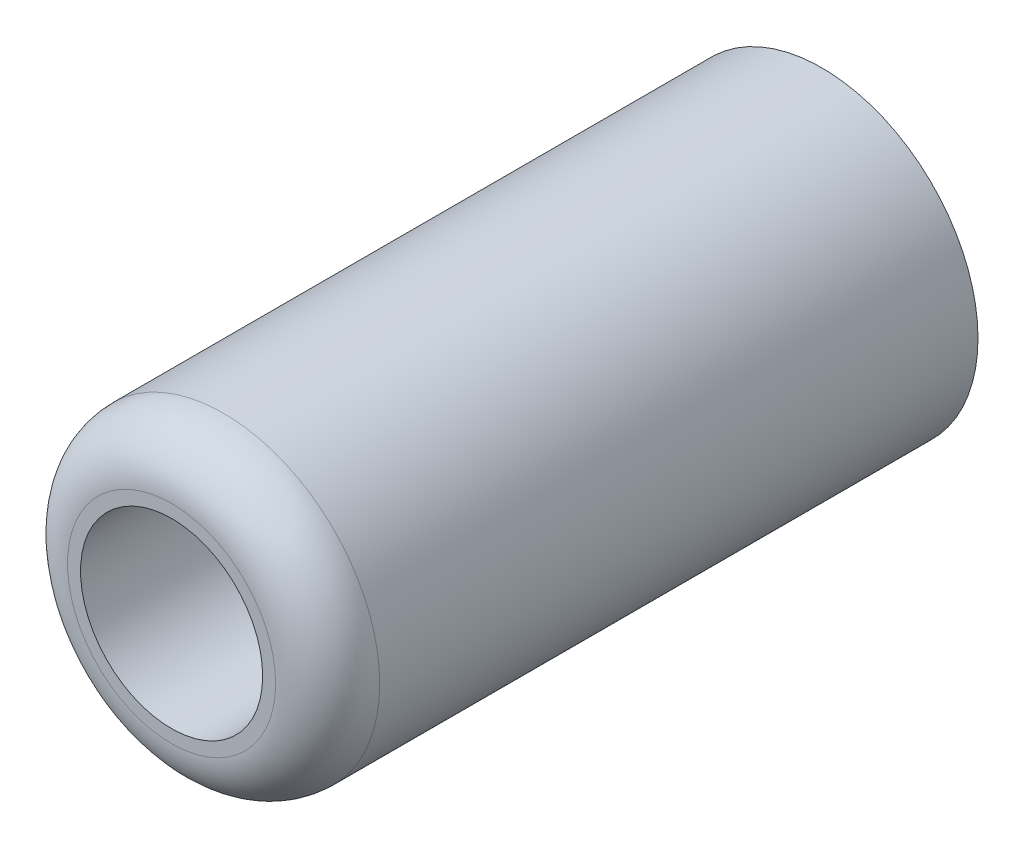
ISO-10303-21;
HEADER;
FILE_DESCRIPTION(('STEP AP214'),'2;1');
FILE_NAME('part.step','',(''),(''),'','','');
FILE_SCHEMA(('AUTOMOTIVE_DESIGN { 1 0 10303 214 1 1 1 1 }'));
ENDSEC;
DATA;
#1=APPLICATION_CONTEXT('core data for automotive mechanical design processes');
#2=APPLICATION_PROTOCOL_DEFINITION('international standard','automotive_design',2000,#1);
#3=PRODUCT_CONTEXT('',#1,'mechanical');
#4=PRODUCT('Part','Part','',(#3));
#5=PRODUCT_RELATED_PRODUCT_CATEGORY('part','',(#4));
#6=PRODUCT_DEFINITION_FORMATION('','',#4);
#7=PRODUCT_DEFINITION_CONTEXT('part definition',#1,'design');
#8=PRODUCT_DEFINITION('design','',#6,#7);
#9=PRODUCT_DEFINITION_SHAPE('','',#8);
#10=(LENGTH_UNIT() NAMED_UNIT(*) SI_UNIT(.MILLI.,.METRE.));
#11=(NAMED_UNIT(*) PLANE_ANGLE_UNIT() SI_UNIT($,.RADIAN.));
#12=(NAMED_UNIT(*) SI_UNIT($,.STERADIAN.) SOLID_ANGLE_UNIT());
#13=UNCERTAINTY_MEASURE_WITH_UNIT(LENGTH_MEASURE(1.E-05),#10,'distance_accuracy_value','');
#14=(GEOMETRIC_REPRESENTATION_CONTEXT(3) GLOBAL_UNCERTAINTY_ASSIGNED_CONTEXT((#13)) GLOBAL_UNIT_ASSIGNED_CONTEXT((#10,
#11,#12)) REPRESENTATION_CONTEXT('',''));
#15=CARTESIAN_POINT('',(0.,0.,0.));
#16=DIRECTION('',(0.,0.,1.));
#17=DIRECTION('',(1.,0.,0.));
#18=AXIS2_PLACEMENT_3D('',#15,#16,#17);
#19=CARTESIAN_POINT('',(0.,0.,12.5));
#20=DIRECTION('',(0.,0.,1.));
#21=DIRECTION('',(1.,0.,0.));
#22=AXIS2_PLACEMENT_3D('',#19,#20,#21);
#23=PLANE('',#22);
#24=CARTESIAN_POINT('',(0.,0.,12.5));
#25=DIRECTION('',(0.,0.,1.));
#26=DIRECTION('',(1.,0.,0.));
#27=AXIS2_PLACEMENT_3D('',#24,#25,#26);
#28=CIRCLE('',#27,2.);
#29=CARTESIAN_POINT('',(2.,0.,12.5));
#30=VERTEX_POINT('',#29);
#31=EDGE_CURVE('E38',#30,#30,#28,.T.);
#32=ORIENTED_EDGE('',*,*,#31,.T.);
#33=EDGE_LOOP('',(#32));
#34=FACE_BOUND('',#33,.T.);
#35=CARTESIAN_POINT('',(0.,0.,12.5));
#36=DIRECTION('',(0.,0.,1.));
#37=DIRECTION('',(1.,0.,0.));
#38=AXIS2_PLACEMENT_3D('',#35,#36,#37);
#39=CIRCLE('',#38,1.75);
#40=CARTESIAN_POINT('',(1.75,0.,12.5));
#41=VERTEX_POINT('',#40);
#42=EDGE_CURVE('E46',#41,#41,#39,.T.);
#43=ORIENTED_EDGE('',*,*,#42,.F.);
#44=EDGE_LOOP('',(#43));
#45=FACE_BOUND('',#44,.T.);
#46=ADVANCED_FACE('F31',(#34,#45),#23,.T.);
#47=CARTESIAN_POINT('',(0.,0.,0.));
#48=DIRECTION('',(0.,0.,1.));
#49=DIRECTION('',(1.,0.,0.));
#50=AXIS2_PLACEMENT_3D('',#47,#48,#49);
#51=PLANE('',#50);
#52=CARTESIAN_POINT('',(0.,0.,0.));
#53=DIRECTION('',(0.,0.,1.));
#54=DIRECTION('',(1.,0.,0.));
#55=AXIS2_PLACEMENT_3D('',#52,#53,#54);
#56=CIRCLE('',#55,3.);
#57=CARTESIAN_POINT('',(3.,0.,0.));
#58=VERTEX_POINT('',#57);
#59=EDGE_CURVE('E42',#58,#58,#56,.T.);
#60=ORIENTED_EDGE('',*,*,#59,.F.);
#61=EDGE_LOOP('',(#60));
#62=FACE_BOUND('',#61,.T.);
#63=CARTESIAN_POINT('',(0.,0.,0.));
#64=DIRECTION('',(0.,0.,1.));
#65=DIRECTION('',(1.,0.,0.));
#66=AXIS2_PLACEMENT_3D('',#63,#64,#65);
#67=CIRCLE('',#66,1.75);
#68=CARTESIAN_POINT('',(1.75,0.,0.));
#69=VERTEX_POINT('',#68);
#70=EDGE_CURVE('E49',#69,#69,#67,.T.);
#71=ORIENTED_EDGE('',*,*,#70,.T.);
#72=EDGE_LOOP('',(#71));
#73=FACE_BOUND('',#72,.T.);
#74=ADVANCED_FACE('F59',(#62,#73),#51,.F.);
#75=CARTESIAN_POINT('',(0.,0.,12.5));
#76=DIRECTION('',(0.,0.,-1.));
#77=DIRECTION('',(-1.,0.,0.));
#78=AXIS2_PLACEMENT_3D('',#75,#76,#77);
#79=CYLINDRICAL_SURFACE('',#78,3.);
#80=CARTESIAN_POINT('',(0.,0.,11.5));
#81=DIRECTION('',(0.,0.,1.));
#82=DIRECTION('',(1.,0.,0.));
#83=AXIS2_PLACEMENT_3D('',#80,#81,#82);
#84=CIRCLE('',#83,3.);
#85=CARTESIAN_POINT('',(3.,0.,11.5));
#86=VERTEX_POINT('',#85);
#87=EDGE_CURVE('E10',#86,#86,#84,.F.);
#88=ORIENTED_EDGE('',*,*,#87,.T.);
#89=EDGE_LOOP('',(#88));
#90=FACE_BOUND('',#89,.T.);
#91=ORIENTED_EDGE('',*,*,#59,.T.);
#92=EDGE_LOOP('',(#91));
#93=FACE_BOUND('',#92,.T.);
#94=ADVANCED_FACE('F64',(#90,#93),#79,.T.);
#95=CARTESIAN_POINT('',(0.,0.,12.5));
#96=DIRECTION('',(0.,0.,-1.));
#97=DIRECTION('',(-1.,0.,0.));
#98=AXIS2_PLACEMENT_3D('',#95,#96,#97);
#99=CYLINDRICAL_SURFACE('',#98,1.75);
#100=ORIENTED_EDGE('',*,*,#42,.T.);
#101=EDGE_LOOP('',(#100));
#102=FACE_BOUND('',#101,.T.);
#103=ORIENTED_EDGE('',*,*,#70,.F.);
#104=EDGE_LOOP('',(#103));
#105=FACE_BOUND('',#104,.T.);
#106=ADVANCED_FACE('F55',(#102,#105),#99,.F.);
#107=CARTESIAN_POINT('',(0.,0.,11.5));
#108=DIRECTION('',(0.,0.,1.));
#109=DIRECTION('',(1.,0.,0.));
#110=AXIS2_PLACEMENT_3D('',#107,#108,#109);
#111=TOROIDAL_SURFACE('',#110,2.,1.);
#112=ORIENTED_EDGE('',*,*,#87,.F.);
#113=EDGE_LOOP('',(#112));
#114=FACE_BOUND('',#113,.T.);
#115=ORIENTED_EDGE('',*,*,#31,.F.);
#116=EDGE_LOOP('',(#115));
#117=FACE_BOUND('',#116,.T.);
#118=ADVANCED_FACE('F33',(#114,#117),#111,.T.);
#119=CLOSED_SHELL('',(#46,#74,#94,#106,#118));
#120=MANIFOLD_SOLID_BREP('B2',#119);
#121=ADVANCED_BREP_SHAPE_REPRESENTATION('',(#18,#120),#14);
#122=SHAPE_DEFINITION_REPRESENTATION(#9,#121);
ENDSEC;
END-ISO-10303-21;
